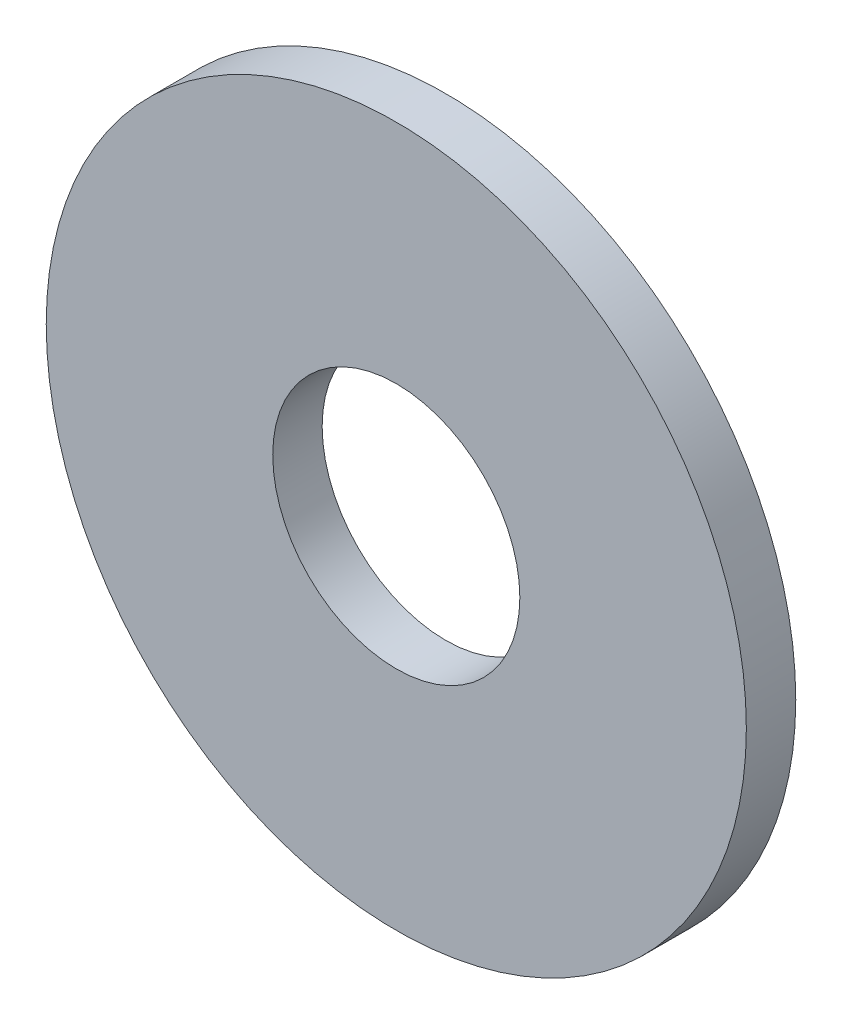
ISO-10303-21;
HEADER;
FILE_DESCRIPTION(('STEP AP214'),'2;1');
FILE_NAME('part.step','',(''),(''),'','','');
FILE_SCHEMA(('AUTOMOTIVE_DESIGN { 1 0 10303 214 1 1 1 1 }'));
ENDSEC;
DATA;
#1=APPLICATION_CONTEXT('core data for automotive mechanical design processes');
#2=APPLICATION_PROTOCOL_DEFINITION('international standard','automotive_design',2000,#1);
#3=PRODUCT_CONTEXT('',#1,'mechanical');
#4=PRODUCT('Part','Part','',(#3));
#5=PRODUCT_RELATED_PRODUCT_CATEGORY('part','',(#4));
#6=PRODUCT_DEFINITION_FORMATION('','',#4);
#7=PRODUCT_DEFINITION_CONTEXT('part definition',#1,'design');
#8=PRODUCT_DEFINITION('design','',#6,#7);
#9=PRODUCT_DEFINITION_SHAPE('','',#8);
#10=(LENGTH_UNIT() NAMED_UNIT(*) SI_UNIT(.MILLI.,.METRE.));
#11=(NAMED_UNIT(*) PLANE_ANGLE_UNIT() SI_UNIT($,.RADIAN.));
#12=(NAMED_UNIT(*) SI_UNIT($,.STERADIAN.) SOLID_ANGLE_UNIT());
#13=UNCERTAINTY_MEASURE_WITH_UNIT(LENGTH_MEASURE(1.E-05),#10,'distance_accuracy_value','');
#14=(GEOMETRIC_REPRESENTATION_CONTEXT(3) GLOBAL_UNCERTAINTY_ASSIGNED_CONTEXT((#13)) GLOBAL_UNIT_ASSIGNED_CONTEXT((#10,
#11,#12)) REPRESENTATION_CONTEXT('',''));
#15=CARTESIAN_POINT('',(0.,0.,0.));
#16=DIRECTION('',(0.,0.,1.));
#17=DIRECTION('',(1.,0.,0.));
#18=AXIS2_PLACEMENT_3D('',#15,#16,#17);
#19=CARTESIAN_POINT('',(0.,0.,6.));
#20=DIRECTION('',(0.,0.,1.));
#21=DIRECTION('',(1.,0.,0.));
#22=AXIS2_PLACEMENT_3D('',#19,#20,#21);
#23=PLANE('',#22);
#24=CARTESIAN_POINT('',(0.,0.,6.));
#25=DIRECTION('',(0.,0.,1.));
#26=DIRECTION('',(1.,0.,0.));
#27=AXIS2_PLACEMENT_3D('',#24,#25,#26);
#28=CIRCLE('',#27,42.5);
#29=CARTESIAN_POINT('',(42.5,0.,6.));
#30=VERTEX_POINT('',#29);
#31=EDGE_CURVE('E10',#30,#30,#28,.T.);
#32=ORIENTED_EDGE('',*,*,#31,.T.);
#33=EDGE_LOOP('',(#32));
#34=FACE_BOUND('',#33,.T.);
#35=CARTESIAN_POINT('',(0.,0.,6.));
#36=DIRECTION('',(0.,0.,1.));
#37=DIRECTION('',(1.,0.,0.));
#38=AXIS2_PLACEMENT_3D('',#35,#36,#37);
#39=CIRCLE('',#38,15.);
#40=CARTESIAN_POINT('',(15.,0.,6.));
#41=VERTEX_POINT('',#40);
#42=EDGE_CURVE('E41',#41,#41,#39,.T.);
#43=ORIENTED_EDGE('',*,*,#42,.F.);
#44=EDGE_LOOP('',(#43));
#45=FACE_BOUND('',#44,.T.);
#46=ADVANCED_FACE('F30',(#34,#45),#23,.T.);
#47=CARTESIAN_POINT('',(0.,0.,0.));
#48=DIRECTION('',(0.,0.,1.));
#49=DIRECTION('',(1.,0.,0.));
#50=AXIS2_PLACEMENT_3D('',#47,#48,#49);
#51=PLANE('',#50);
#52=CARTESIAN_POINT('',(0.,0.,0.));
#53=DIRECTION('',(0.,0.,1.));
#54=DIRECTION('',(1.,0.,0.));
#55=AXIS2_PLACEMENT_3D('',#52,#53,#54);
#56=CIRCLE('',#55,42.5);
#57=CARTESIAN_POINT('',(42.5,0.,0.));
#58=VERTEX_POINT('',#57);
#59=EDGE_CURVE('E34',#58,#58,#56,.T.);
#60=ORIENTED_EDGE('',*,*,#59,.F.);
#61=EDGE_LOOP('',(#60));
#62=FACE_BOUND('',#61,.T.);
#63=CARTESIAN_POINT('',(0.,0.,0.));
#64=DIRECTION('',(0.,0.,1.));
#65=DIRECTION('',(1.,0.,0.));
#66=AXIS2_PLACEMENT_3D('',#63,#64,#65);
#67=CIRCLE('',#66,15.);
#68=CARTESIAN_POINT('',(15.,0.,0.));
#69=VERTEX_POINT('',#68);
#70=EDGE_CURVE('E43',#69,#69,#67,.T.);
#71=ORIENTED_EDGE('',*,*,#70,.T.);
#72=EDGE_LOOP('',(#71));
#73=FACE_BOUND('',#72,.T.);
#74=ADVANCED_FACE('F53',(#62,#73),#51,.F.);
#75=CARTESIAN_POINT('',(0.,0.,6.));
#76=DIRECTION('',(0.,0.,-1.));
#77=DIRECTION('',(-1.,0.,0.));
#78=AXIS2_PLACEMENT_3D('',#75,#76,#77);
#79=CYLINDRICAL_SURFACE('',#78,42.5);
#80=ORIENTED_EDGE('',*,*,#31,.F.);
#81=EDGE_LOOP('',(#80));
#82=FACE_BOUND('',#81,.T.);
#83=ORIENTED_EDGE('',*,*,#59,.T.);
#84=EDGE_LOOP('',(#83));
#85=FACE_BOUND('',#84,.T.);
#86=ADVANCED_FACE('F32',(#82,#85),#79,.T.);
#87=CARTESIAN_POINT('',(0.,0.,6.));
#88=DIRECTION('',(0.,0.,-1.));
#89=DIRECTION('',(-1.,0.,0.));
#90=AXIS2_PLACEMENT_3D('',#87,#88,#89);
#91=CYLINDRICAL_SURFACE('',#90,15.);
#92=ORIENTED_EDGE('',*,*,#42,.T.);
#93=EDGE_LOOP('',(#92));
#94=FACE_BOUND('',#93,.T.);
#95=ORIENTED_EDGE('',*,*,#70,.F.);
#96=EDGE_LOOP('',(#95));
#97=FACE_BOUND('',#96,.T.);
#98=ADVANCED_FACE('F49',(#94,#97),#91,.F.);
#99=CLOSED_SHELL('',(#46,#74,#86,#98));
#100=MANIFOLD_SOLID_BREP('B2',#99);
#101=ADVANCED_BREP_SHAPE_REPRESENTATION('',(#18,#100),#14);
#102=SHAPE_DEFINITION_REPRESENTATION(#9,#101);
ENDSEC;
END-ISO-10303-21;
